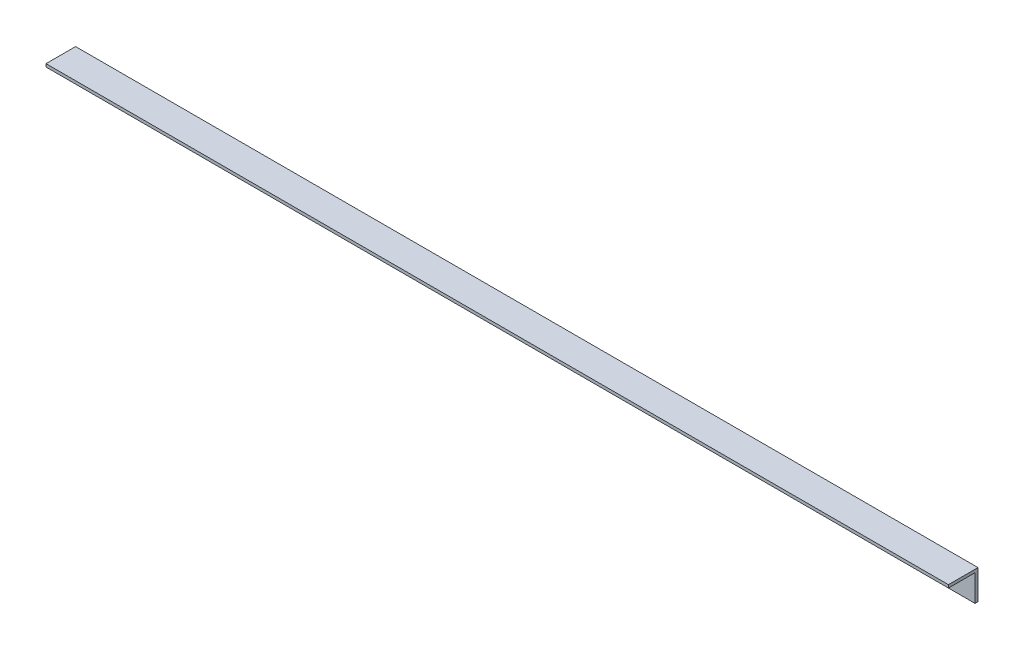
ISO-10303-21;
HEADER;
FILE_DESCRIPTION(('STEP AP214'),'2;1');
FILE_NAME('part.step','',(''),(''),'','','');
FILE_SCHEMA(('AUTOMOTIVE_DESIGN { 1 0 10303 214 1 1 1 1 }'));
ENDSEC;
DATA;
#1=APPLICATION_CONTEXT('core data for automotive mechanical design processes');
#2=APPLICATION_PROTOCOL_DEFINITION('international standard','automotive_design',2000,#1);
#3=PRODUCT_CONTEXT('',#1,'mechanical');
#4=PRODUCT('Part','Part','',(#3));
#5=PRODUCT_RELATED_PRODUCT_CATEGORY('part','',(#4));
#6=PRODUCT_DEFINITION_FORMATION('','',#4);
#7=PRODUCT_DEFINITION_CONTEXT('part definition',#1,'design');
#8=PRODUCT_DEFINITION('design','',#6,#7);
#9=PRODUCT_DEFINITION_SHAPE('','',#8);
#10=(LENGTH_UNIT() NAMED_UNIT(*) SI_UNIT(.MILLI.,.METRE.));
#11=(NAMED_UNIT(*) PLANE_ANGLE_UNIT() SI_UNIT($,.RADIAN.));
#12=(NAMED_UNIT(*) SI_UNIT($,.STERADIAN.) SOLID_ANGLE_UNIT());
#13=UNCERTAINTY_MEASURE_WITH_UNIT(LENGTH_MEASURE(1.E-05),#10,'distance_accuracy_value','');
#14=(GEOMETRIC_REPRESENTATION_CONTEXT(3) GLOBAL_UNCERTAINTY_ASSIGNED_CONTEXT((#13)) GLOBAL_UNIT_ASSIGNED_CONTEXT((#10,
#11,#12)) REPRESENTATION_CONTEXT('',''));
#15=CARTESIAN_POINT('',(0.,0.,0.));
#16=DIRECTION('',(0.,0.,1.));
#17=DIRECTION('',(1.,0.,0.));
#18=AXIS2_PLACEMENT_3D('',#15,#16,#17);
#19=CARTESIAN_POINT('',(0.,0.,2.));
#20=DIRECTION('',(0.,0.,-1.));
#21=DIRECTION('',(-1.,0.,0.));
#22=AXIS2_PLACEMENT_3D('',#19,#20,#21);
#23=PLANE('',#22);
#24=DIRECTION('',(1.,0.,0.));
#25=VECTOR('',#24,1.);
#26=CARTESIAN_POINT('',(0.,18.,2.));
#27=LINE('',#26,#25);
#28=CARTESIAN_POINT('',(0.,18.,2.));
#29=VERTEX_POINT('',#28);
#30=CARTESIAN_POINT('',(610.,18.,2.));
#31=VERTEX_POINT('',#30);
#32=EDGE_CURVE('E47',#29,#31,#27,.T.);
#33=ORIENTED_EDGE('',*,*,#32,.F.);
#34=DIRECTION('',(0.,-1.,0.));
#35=VECTOR('',#34,1.);
#36=CARTESIAN_POINT('',(0.,0.,2.));
#37=LINE('',#36,#35);
#38=CARTESIAN_POINT('',(0.,0.,2.));
#39=VERTEX_POINT('',#38);
#40=EDGE_CURVE('E84',#29,#39,#37,.T.);
#41=ORIENTED_EDGE('',*,*,#40,.T.);
#42=DIRECTION('',(1.,0.,0.));
#43=VECTOR('',#42,1.);
#44=CARTESIAN_POINT('',(0.,0.,2.));
#45=LINE('',#44,#43);
#46=CARTESIAN_POINT('',(610.,0.,2.));
#47=VERTEX_POINT('',#46);
#48=EDGE_CURVE('E53',#39,#47,#45,.T.);
#49=ORIENTED_EDGE('',*,*,#48,.T.);
#50=DIRECTION('',(0.,1.,0.));
#51=VECTOR('',#50,1.);
#52=CARTESIAN_POINT('',(610.,0.,2.));
#53=LINE('',#52,#51);
#54=EDGE_CURVE('E95',#47,#31,#53,.T.);
#55=ORIENTED_EDGE('',*,*,#54,.T.);
#56=EDGE_LOOP('',(#33,#41,#49,#55));
#57=FACE_BOUND('',#56,.T.);
#58=ADVANCED_FACE('F32',(#57),#23,.F.);
#59=CARTESIAN_POINT('',(0.,0.,2.));
#60=DIRECTION('',(1.,0.,0.));
#61=DIRECTION('',(0.,0.,-1.));
#62=AXIS2_PLACEMENT_3D('',#59,#60,#61);
#63=PLANE('',#62);
#64=DIRECTION('',(0.,-1.,0.));
#65=VECTOR('',#64,1.);
#66=CARTESIAN_POINT('',(0.,0.,0.));
#67=LINE('',#66,#65);
#68=CARTESIAN_POINT('',(0.,20.,0.));
#69=VERTEX_POINT('',#68);
#70=CARTESIAN_POINT('',(0.,0.,0.));
#71=VERTEX_POINT('',#70);
#72=EDGE_CURVE('E91',#69,#71,#67,.T.);
#73=ORIENTED_EDGE('',*,*,#72,.T.);
#74=DIRECTION('',(0.,0.,-1.));
#75=VECTOR('',#74,1.);
#76=CARTESIAN_POINT('',(0.,0.,2.));
#77=LINE('',#76,#75);
#78=EDGE_CURVE('E11',#39,#71,#77,.T.);
#79=ORIENTED_EDGE('',*,*,#78,.F.);
#80=ORIENTED_EDGE('',*,*,#40,.F.);
#81=DIRECTION('',(0.,0.,-1.));
#82=VECTOR('',#81,1.);
#83=CARTESIAN_POINT('',(0.,18.,20.));
#84=LINE('',#83,#82);
#85=CARTESIAN_POINT('',(0.,18.,20.));
#86=VERTEX_POINT('',#85);
#87=EDGE_CURVE('E99',#86,#29,#84,.T.);
#88=ORIENTED_EDGE('',*,*,#87,.F.);
#89=DIRECTION('',(0.,-1.,0.));
#90=VECTOR('',#89,1.);
#91=CARTESIAN_POINT('',(0.,20.,20.));
#92=LINE('',#91,#90);
#93=CARTESIAN_POINT('',(0.,20.,20.));
#94=VERTEX_POINT('',#93);
#95=EDGE_CURVE('E94',#94,#86,#92,.T.);
#96=ORIENTED_EDGE('',*,*,#95,.F.);
#97=DIRECTION('',(0.,0.,-1.));
#98=VECTOR('',#97,1.);
#99=CARTESIAN_POINT('',(0.,20.,2.));
#100=LINE('',#99,#98);
#101=EDGE_CURVE('E77',#94,#69,#100,.T.);
#102=ORIENTED_EDGE('',*,*,#101,.T.);
#103=EDGE_LOOP('',(#73,#79,#80,#88,#96,#102));
#104=FACE_BOUND('',#103,.T.);
#105=ADVANCED_FACE('F34',(#104),#63,.F.);
#106=CARTESIAN_POINT('',(0.,0.,2.));
#107=DIRECTION('',(0.,1.,0.));
#108=DIRECTION('',(0.,0.,1.));
#109=AXIS2_PLACEMENT_3D('',#106,#107,#108);
#110=PLANE('',#109);
#111=DIRECTION('',(1.,0.,0.));
#112=VECTOR('',#111,1.);
#113=CARTESIAN_POINT('',(0.,0.,0.));
#114=LINE('',#113,#112);
#115=CARTESIAN_POINT('',(610.,0.,0.));
#116=VERTEX_POINT('',#115);
#117=EDGE_CURVE('E98',#71,#116,#114,.T.);
#118=ORIENTED_EDGE('',*,*,#117,.T.);
#119=DIRECTION('',(0.,0.,-1.));
#120=VECTOR('',#119,1.);
#121=CARTESIAN_POINT('',(610.,0.,2.));
#122=LINE('',#121,#120);
#123=EDGE_CURVE('E40',#47,#116,#122,.T.);
#124=ORIENTED_EDGE('',*,*,#123,.F.);
#125=ORIENTED_EDGE('',*,*,#48,.F.);
#126=ORIENTED_EDGE('',*,*,#78,.T.);
#127=EDGE_LOOP('',(#118,#124,#125,#126));
#128=FACE_BOUND('',#127,.T.);
#129=ADVANCED_FACE('F115',(#128),#110,.F.);
#130=CARTESIAN_POINT('',(610.,0.,2.));
#131=DIRECTION('',(-1.,0.,0.));
#132=DIRECTION('',(0.,0.,1.));
#133=AXIS2_PLACEMENT_3D('',#130,#131,#132);
#134=PLANE('',#133);
#135=DIRECTION('',(0.,1.,0.));
#136=VECTOR('',#135,1.);
#137=CARTESIAN_POINT('',(610.,0.,0.));
#138=LINE('',#137,#136);
#139=CARTESIAN_POINT('',(610.,20.,0.));
#140=VERTEX_POINT('',#139);
#141=EDGE_CURVE('E85',#116,#140,#138,.T.);
#142=ORIENTED_EDGE('',*,*,#141,.T.);
#143=DIRECTION('',(0.,0.,-1.));
#144=VECTOR('',#143,1.);
#145=CARTESIAN_POINT('',(610.,20.,2.));
#146=LINE('',#145,#144);
#147=CARTESIAN_POINT('',(610.,20.,20.));
#148=VERTEX_POINT('',#147);
#149=EDGE_CURVE('E80',#148,#140,#146,.T.);
#150=ORIENTED_EDGE('',*,*,#149,.F.);
#151=DIRECTION('',(0.,1.,0.));
#152=VECTOR('',#151,1.);
#153=CARTESIAN_POINT('',(610.,20.,20.));
#154=LINE('',#153,#152);
#155=CARTESIAN_POINT('',(610.,18.,20.));
#156=VERTEX_POINT('',#155);
#157=EDGE_CURVE('E130',#156,#148,#154,.T.);
#158=ORIENTED_EDGE('',*,*,#157,.F.);
#159=DIRECTION('',(0.,0.,-1.));
#160=VECTOR('',#159,1.);
#161=CARTESIAN_POINT('',(610.,18.,20.));
#162=LINE('',#161,#160);
#163=EDGE_CURVE('E103',#156,#31,#162,.T.);
#164=ORIENTED_EDGE('',*,*,#163,.T.);
#165=ORIENTED_EDGE('',*,*,#54,.F.);
#166=ORIENTED_EDGE('',*,*,#123,.T.);
#167=EDGE_LOOP('',(#142,#150,#158,#164,#165,#166));
#168=FACE_BOUND('',#167,.T.);
#169=ADVANCED_FACE('F112',(#168),#134,.F.);
#170=CARTESIAN_POINT('',(0.,20.,2.));
#171=DIRECTION('',(0.,-1.,0.));
#172=DIRECTION('',(0.,0.,-1.));
#173=AXIS2_PLACEMENT_3D('',#170,#171,#172);
#174=PLANE('',#173);
#175=DIRECTION('',(-1.,0.,0.));
#176=VECTOR('',#175,1.);
#177=CARTESIAN_POINT('',(0.,20.,0.));
#178=LINE('',#177,#176);
#179=EDGE_CURVE('E73',#140,#69,#178,.T.);
#180=ORIENTED_EDGE('',*,*,#179,.T.);
#181=ORIENTED_EDGE('',*,*,#101,.F.);
#182=DIRECTION('',(-1.,0.,0.));
#183=VECTOR('',#182,1.);
#184=CARTESIAN_POINT('',(0.,20.,20.));
#185=LINE('',#184,#183);
#186=EDGE_CURVE('E133',#148,#94,#185,.T.);
#187=ORIENTED_EDGE('',*,*,#186,.F.);
#188=ORIENTED_EDGE('',*,*,#149,.T.);
#189=EDGE_LOOP('',(#180,#181,#187,#188));
#190=FACE_BOUND('',#189,.T.);
#191=ADVANCED_FACE('F75',(#190),#174,.F.);
#192=CARTESIAN_POINT('',(0.,0.,0.));
#193=DIRECTION('',(0.,0.,-1.));
#194=DIRECTION('',(-1.,0.,0.));
#195=AXIS2_PLACEMENT_3D('',#192,#193,#194);
#196=PLANE('',#195);
#197=ORIENTED_EDGE('',*,*,#72,.F.);
#198=ORIENTED_EDGE('',*,*,#179,.F.);
#199=ORIENTED_EDGE('',*,*,#141,.F.);
#200=ORIENTED_EDGE('',*,*,#117,.F.);
#201=EDGE_LOOP('',(#197,#198,#199,#200));
#202=FACE_BOUND('',#201,.T.);
#203=ADVANCED_FACE('F97',(#202),#196,.T.);
#204=CARTESIAN_POINT('',(0.,18.,20.));
#205=DIRECTION('',(0.,1.,0.));
#206=DIRECTION('',(0.,0.,1.));
#207=AXIS2_PLACEMENT_3D('',#204,#205,#206);
#208=PLANE('',#207);
#209=ORIENTED_EDGE('',*,*,#32,.T.);
#210=ORIENTED_EDGE('',*,*,#163,.F.);
#211=DIRECTION('',(1.,0.,0.));
#212=VECTOR('',#211,1.);
#213=CARTESIAN_POINT('',(0.,18.,20.));
#214=LINE('',#213,#212);
#215=EDGE_CURVE('E124',#86,#156,#214,.T.);
#216=ORIENTED_EDGE('',*,*,#215,.F.);
#217=ORIENTED_EDGE('',*,*,#87,.T.);
#218=EDGE_LOOP('',(#209,#210,#216,#217));
#219=FACE_BOUND('',#218,.T.);
#220=ADVANCED_FACE('F120',(#219),#208,.F.);
#221=CARTESIAN_POINT('',(0.,0.,20.));
#222=DIRECTION('',(0.,0.,1.));
#223=DIRECTION('',(1.,0.,0.));
#224=AXIS2_PLACEMENT_3D('',#221,#222,#223);
#225=PLANE('',#224);
#226=ORIENTED_EDGE('',*,*,#95,.T.);
#227=ORIENTED_EDGE('',*,*,#215,.T.);
#228=ORIENTED_EDGE('',*,*,#157,.T.);
#229=ORIENTED_EDGE('',*,*,#186,.T.);
#230=EDGE_LOOP('',(#226,#227,#228,#229));
#231=FACE_BOUND('',#230,.T.);
#232=ADVANCED_FACE('F132',(#231),#225,.T.);
#233=CLOSED_SHELL('',(#58,#105,#129,#169,#191,#203,#220,#232));
#234=MANIFOLD_SOLID_BREP('B2',#233);
#235=ADVANCED_BREP_SHAPE_REPRESENTATION('',(#18,#234),#14);
#236=SHAPE_DEFINITION_REPRESENTATION(#9,#235);
ENDSEC;
END-ISO-10303-21;
